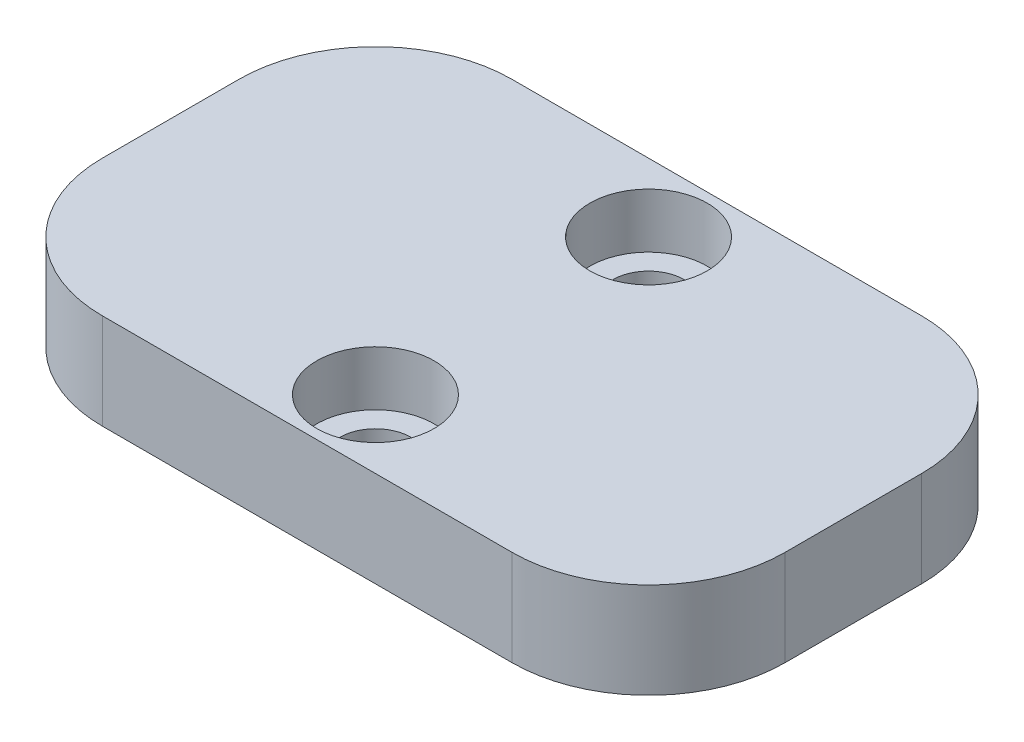
ISO-10303-21;
HEADER;
FILE_DESCRIPTION(('STEP AP214'),'2;1');
FILE_NAME('part.step','',(''),(''),'','','');
FILE_SCHEMA(('AUTOMOTIVE_DESIGN { 1 0 10303 214 1 1 1 1 }'));
ENDSEC;
DATA;
#1=APPLICATION_CONTEXT('core data for automotive mechanical design processes');
#2=APPLICATION_PROTOCOL_DEFINITION('international standard','automotive_design',2000,#1);
#3=PRODUCT_CONTEXT('',#1,'mechanical');
#4=PRODUCT('Part','Part','',(#3));
#5=PRODUCT_RELATED_PRODUCT_CATEGORY('part','',(#4));
#6=PRODUCT_DEFINITION_FORMATION('','',#4);
#7=PRODUCT_DEFINITION_CONTEXT('part definition',#1,'design');
#8=PRODUCT_DEFINITION('design','',#6,#7);
#9=PRODUCT_DEFINITION_SHAPE('','',#8);
#10=(LENGTH_UNIT() NAMED_UNIT(*) SI_UNIT(.MILLI.,.METRE.));
#11=(NAMED_UNIT(*) PLANE_ANGLE_UNIT() SI_UNIT($,.RADIAN.));
#12=(NAMED_UNIT(*) SI_UNIT($,.STERADIAN.) SOLID_ANGLE_UNIT());
#13=UNCERTAINTY_MEASURE_WITH_UNIT(LENGTH_MEASURE(1.E-05),#10,'distance_accuracy_value','');
#14=(GEOMETRIC_REPRESENTATION_CONTEXT(3) GLOBAL_UNCERTAINTY_ASSIGNED_CONTEXT((#13)) GLOBAL_UNIT_ASSIGNED_CONTEXT((#10,
#11,#12)) REPRESENTATION_CONTEXT('',''));
#15=CARTESIAN_POINT('',(0.,0.,0.));
#16=DIRECTION('',(0.,0.,1.));
#17=DIRECTION('',(1.,0.,0.));
#18=AXIS2_PLACEMENT_3D('',#15,#16,#17);
#19=CARTESIAN_POINT('',(25.,7.,-25.));
#20=DIRECTION('',(0.,-1.,0.));
#21=DIRECTION('',(0.,0.,-1.));
#22=AXIS2_PLACEMENT_3D('',#19,#20,#21);
#23=CYLINDRICAL_SURFACE('',#22,2.6);
#24=CARTESIAN_POINT('',(25.,0.,-25.));
#25=DIRECTION('',(0.,1.,0.));
#26=DIRECTION('',(0.,0.,1.));
#27=AXIS2_PLACEMENT_3D('',#24,#25,#26);
#28=CIRCLE('',#27,2.6);
#29=CARTESIAN_POINT('',(25.,0.,-22.4));
#30=VERTEX_POINT('',#29);
#31=EDGE_CURVE('E220',#30,#30,#28,.T.);
#32=ORIENTED_EDGE('',*,*,#31,.F.);
#33=EDGE_LOOP('',(#32));
#34=FACE_BOUND('',#33,.T.);
#35=CARTESIAN_POINT('',(25.,3.,-25.));
#36=DIRECTION('',(0.,1.,0.));
#37=DIRECTION('',(0.,0.,1.));
#38=AXIS2_PLACEMENT_3D('',#35,#36,#37);
#39=CIRCLE('',#38,2.6);
#40=CARTESIAN_POINT('',(25.,3.,-22.4));
#41=VERTEX_POINT('',#40);
#42=EDGE_CURVE('E51',#41,#41,#39,.T.);
#43=ORIENTED_EDGE('',*,*,#42,.T.);
#44=EDGE_LOOP('',(#43));
#45=FACE_BOUND('',#44,.T.);
#46=ADVANCED_FACE('F47',(#34,#45),#23,.F.);
#47=CARTESIAN_POINT('',(25.,7.,-5.));
#48=DIRECTION('',(0.,-1.,0.));
#49=DIRECTION('',(0.,0.,-1.));
#50=AXIS2_PLACEMENT_3D('',#47,#48,#49);
#51=CYLINDRICAL_SURFACE('',#50,2.6);
#52=CARTESIAN_POINT('',(25.,0.,-5.));
#53=DIRECTION('',(0.,1.,0.));
#54=DIRECTION('',(0.,0.,1.));
#55=AXIS2_PLACEMENT_3D('',#52,#53,#54);
#56=CIRCLE('',#55,2.6);
#57=CARTESIAN_POINT('',(25.,0.,-2.4));
#58=VERTEX_POINT('',#57);
#59=EDGE_CURVE('E199',#58,#58,#56,.T.);
#60=ORIENTED_EDGE('',*,*,#59,.F.);
#61=EDGE_LOOP('',(#60));
#62=FACE_BOUND('',#61,.T.);
#63=CARTESIAN_POINT('',(25.,3.,-5.));
#64=DIRECTION('',(0.,1.,0.));
#65=DIRECTION('',(0.,0.,1.));
#66=AXIS2_PLACEMENT_3D('',#63,#64,#65);
#67=CIRCLE('',#66,2.6);
#68=CARTESIAN_POINT('',(25.,3.,-2.4));
#69=VERTEX_POINT('',#68);
#70=EDGE_CURVE('E190',#69,#69,#67,.T.);
#71=ORIENTED_EDGE('',*,*,#70,.T.);
#72=EDGE_LOOP('',(#71));
#73=FACE_BOUND('',#72,.T.);
#74=ADVANCED_FACE('F256',(#62,#73),#51,.F.);
#75=CARTESIAN_POINT('',(0.,7.,0.));
#76=DIRECTION('',(0.,-1.,0.));
#77=DIRECTION('',(0.,0.,-1.));
#78=AXIS2_PLACEMENT_3D('',#75,#76,#77);
#79=PLANE('',#78);
#80=CARTESIAN_POINT('',(25.,7.,-25.));
#81=DIRECTION('',(0.,1.,0.));
#82=DIRECTION('',(0.,0.,1.));
#83=AXIS2_PLACEMENT_3D('',#80,#81,#82);
#84=CIRCLE('',#83,4.3);
#85=CARTESIAN_POINT('',(25.,7.,-20.7));
#86=VERTEX_POINT('',#85);
#87=EDGE_CURVE('E201',#86,#86,#84,.T.);
#88=ORIENTED_EDGE('',*,*,#87,.F.);
#89=EDGE_LOOP('',(#88));
#90=FACE_BOUND('',#89,.T.);
#91=CARTESIAN_POINT('',(25.,7.,-5.));
#92=DIRECTION('',(0.,1.,0.));
#93=DIRECTION('',(0.,0.,1.));
#94=AXIS2_PLACEMENT_3D('',#91,#92,#93);
#95=CIRCLE('',#94,4.3);
#96=CARTESIAN_POINT('',(25.,7.,-0.7));
#97=VERTEX_POINT('',#96);
#98=EDGE_CURVE('E207',#97,#97,#95,.T.);
#99=ORIENTED_EDGE('',*,*,#98,.F.);
#100=EDGE_LOOP('',(#99));
#101=FACE_BOUND('',#100,.T.);
#102=DIRECTION('',(0.,0.,-1.));
#103=VECTOR('',#102,1.);
#104=CARTESIAN_POINT('',(50.,7.,0.));
#105=LINE('',#104,#103);
#106=CARTESIAN_POINT('',(50.,7.,-10.));
#107=VERTEX_POINT('',#106);
#108=CARTESIAN_POINT('',(50.,7.,-20.));
#109=VERTEX_POINT('',#108);
#110=EDGE_CURVE('E227',#107,#109,#105,.T.);
#111=ORIENTED_EDGE('',*,*,#110,.T.);
#112=CARTESIAN_POINT('',(40.,7.,-20.));
#113=DIRECTION('',(0.,-1.,0.));
#114=DIRECTION('',(0.,0.,-1.));
#115=AXIS2_PLACEMENT_3D('',#112,#113,#114);
#116=CIRCLE('',#115,10.);
#117=CARTESIAN_POINT('',(40.,7.,-30.));
#118=VERTEX_POINT('',#117);
#119=EDGE_CURVE('E179',#109,#118,#116,.F.);
#120=ORIENTED_EDGE('',*,*,#119,.T.);
#121=DIRECTION('',(-1.,0.,0.));
#122=VECTOR('',#121,1.);
#123=CARTESIAN_POINT('',(0.,7.,-30.));
#124=LINE('',#123,#122);
#125=CARTESIAN_POINT('',(10.,7.,-30.));
#126=VERTEX_POINT('',#125);
#127=EDGE_CURVE('E137',#118,#126,#124,.T.);
#128=ORIENTED_EDGE('',*,*,#127,.T.);
#129=CARTESIAN_POINT('',(10.,7.,-20.));
#130=DIRECTION('',(0.,-1.,0.));
#131=DIRECTION('',(0.,0.,-1.));
#132=AXIS2_PLACEMENT_3D('',#129,#130,#131);
#133=CIRCLE('',#132,10.);
#134=CARTESIAN_POINT('',(0.,7.,-20.));
#135=VERTEX_POINT('',#134);
#136=EDGE_CURVE('E176',#126,#135,#133,.F.);
#137=ORIENTED_EDGE('',*,*,#136,.T.);
#138=DIRECTION('',(0.,0.,1.));
#139=VECTOR('',#138,1.);
#140=CARTESIAN_POINT('',(0.,7.,0.));
#141=LINE('',#140,#139);
#142=CARTESIAN_POINT('',(0.,7.,-10.));
#143=VERTEX_POINT('',#142);
#144=EDGE_CURVE('E146',#135,#143,#141,.T.);
#145=ORIENTED_EDGE('',*,*,#144,.T.);
#146=CARTESIAN_POINT('',(10.,7.,-10.));
#147=DIRECTION('',(0.,-1.,0.));
#148=DIRECTION('',(0.,0.,-1.));
#149=AXIS2_PLACEMENT_3D('',#146,#147,#148);
#150=CIRCLE('',#149,10.);
#151=CARTESIAN_POINT('',(10.,7.,0.));
#152=VERTEX_POINT('',#151);
#153=EDGE_CURVE('E71',#143,#152,#150,.F.);
#154=ORIENTED_EDGE('',*,*,#153,.T.);
#155=DIRECTION('',(1.,0.,0.));
#156=VECTOR('',#155,1.);
#157=CARTESIAN_POINT('',(0.,7.,0.));
#158=LINE('',#157,#156);
#159=CARTESIAN_POINT('',(40.,7.,0.));
#160=VERTEX_POINT('',#159);
#161=EDGE_CURVE('E151',#152,#160,#158,.T.);
#162=ORIENTED_EDGE('',*,*,#161,.T.);
#163=CARTESIAN_POINT('',(40.,7.,-10.));
#164=DIRECTION('',(0.,-1.,0.));
#165=DIRECTION('',(0.,0.,-1.));
#166=AXIS2_PLACEMENT_3D('',#163,#164,#165);
#167=CIRCLE('',#166,10.);
#168=EDGE_CURVE('E171',#160,#107,#167,.F.);
#169=ORIENTED_EDGE('',*,*,#168,.T.);
#170=EDGE_LOOP('',(#111,#120,#128,#137,#145,#154,#162,#169));
#171=FACE_BOUND('',#170,.T.);
#172=ADVANCED_FACE('F243',(#90,#101,#171),#79,.F.);
#173=CARTESIAN_POINT('',(0.,0.,0.));
#174=DIRECTION('',(0.,-1.,0.));
#175=DIRECTION('',(0.,0.,-1.));
#176=AXIS2_PLACEMENT_3D('',#173,#174,#175);
#177=PLANE('',#176);
#178=ORIENTED_EDGE('',*,*,#31,.T.);
#179=EDGE_LOOP('',(#178));
#180=FACE_BOUND('',#179,.T.);
#181=DIRECTION('',(-1.,0.,0.));
#182=VECTOR('',#181,1.);
#183=CARTESIAN_POINT('',(0.,0.,-30.));
#184=LINE('',#183,#182);
#185=CARTESIAN_POINT('',(40.,0.,-30.));
#186=VERTEX_POINT('',#185);
#187=CARTESIAN_POINT('',(10.,0.,-30.));
#188=VERTEX_POINT('',#187);
#189=EDGE_CURVE('E134',#186,#188,#184,.T.);
#190=ORIENTED_EDGE('',*,*,#189,.F.);
#191=CARTESIAN_POINT('',(40.,0.,-20.));
#192=DIRECTION('',(0.,-1.,0.));
#193=DIRECTION('',(0.,0.,-1.));
#194=AXIS2_PLACEMENT_3D('',#191,#192,#193);
#195=CIRCLE('',#194,10.);
#196=CARTESIAN_POINT('',(50.,0.,-20.));
#197=VERTEX_POINT('',#196);
#198=EDGE_CURVE('E116',#186,#197,#195,.T.);
#199=ORIENTED_EDGE('',*,*,#198,.T.);
#200=DIRECTION('',(0.,0.,-1.));
#201=VECTOR('',#200,1.);
#202=CARTESIAN_POINT('',(50.,0.,0.));
#203=LINE('',#202,#201);
#204=CARTESIAN_POINT('',(50.,0.,-10.));
#205=VERTEX_POINT('',#204);
#206=EDGE_CURVE('E147',#205,#197,#203,.T.);
#207=ORIENTED_EDGE('',*,*,#206,.F.);
#208=CARTESIAN_POINT('',(40.,0.,-10.));
#209=DIRECTION('',(0.,-1.,0.));
#210=DIRECTION('',(0.,0.,-1.));
#211=AXIS2_PLACEMENT_3D('',#208,#209,#210);
#212=CIRCLE('',#211,10.);
#213=CARTESIAN_POINT('',(40.,0.,0.));
#214=VERTEX_POINT('',#213);
#215=EDGE_CURVE('E139',#205,#214,#212,.T.);
#216=ORIENTED_EDGE('',*,*,#215,.T.);
#217=DIRECTION('',(1.,0.,0.));
#218=VECTOR('',#217,1.);
#219=CARTESIAN_POINT('',(0.,0.,0.));
#220=LINE('',#219,#218);
#221=CARTESIAN_POINT('',(10.,0.,0.));
#222=VERTEX_POINT('',#221);
#223=EDGE_CURVE('E153',#222,#214,#220,.T.);
#224=ORIENTED_EDGE('',*,*,#223,.F.);
#225=CARTESIAN_POINT('',(10.,0.,-10.));
#226=DIRECTION('',(0.,-1.,0.));
#227=DIRECTION('',(0.,0.,-1.));
#228=AXIS2_PLACEMENT_3D('',#225,#226,#227);
#229=CIRCLE('',#228,10.);
#230=CARTESIAN_POINT('',(0.,0.,-10.));
#231=VERTEX_POINT('',#230);
#232=EDGE_CURVE('E161',#222,#231,#229,.T.);
#233=ORIENTED_EDGE('',*,*,#232,.T.);
#234=DIRECTION('',(0.,0.,1.));
#235=VECTOR('',#234,1.);
#236=CARTESIAN_POINT('',(0.,0.,0.));
#237=LINE('',#236,#235);
#238=CARTESIAN_POINT('',(0.,0.,-20.));
#239=VERTEX_POINT('',#238);
#240=EDGE_CURVE('E223',#239,#231,#237,.T.);
#241=ORIENTED_EDGE('',*,*,#240,.F.);
#242=CARTESIAN_POINT('',(10.,0.,-20.));
#243=DIRECTION('',(0.,-1.,0.));
#244=DIRECTION('',(0.,0.,-1.));
#245=AXIS2_PLACEMENT_3D('',#242,#243,#244);
#246=CIRCLE('',#245,10.);
#247=EDGE_CURVE('E128',#239,#188,#246,.T.);
#248=ORIENTED_EDGE('',*,*,#247,.T.);
#249=EDGE_LOOP('',(#190,#199,#207,#216,#224,#233,#241,#248));
#250=FACE_BOUND('',#249,.T.);
#251=ORIENTED_EDGE('',*,*,#59,.T.);
#252=EDGE_LOOP('',(#251));
#253=FACE_BOUND('',#252,.T.);
#254=ADVANCED_FACE('F142',(#180,#250,#253),#177,.T.);
#255=CARTESIAN_POINT('',(0.,7.,0.));
#256=DIRECTION('',(1.,0.,0.));
#257=DIRECTION('',(0.,0.,-1.));
#258=AXIS2_PLACEMENT_3D('',#255,#256,#257);
#259=PLANE('',#258);
#260=ORIENTED_EDGE('',*,*,#144,.F.);
#261=DIRECTION('',(0.,-1.,0.));
#262=VECTOR('',#261,1.);
#263=CARTESIAN_POINT('',(0.,7.,-20.));
#264=LINE('',#263,#262);
#265=EDGE_CURVE('E185',#135,#239,#264,.T.);
#266=ORIENTED_EDGE('',*,*,#265,.T.);
#267=ORIENTED_EDGE('',*,*,#240,.T.);
#268=DIRECTION('',(0.,-1.,0.));
#269=VECTOR('',#268,1.);
#270=CARTESIAN_POINT('',(0.,7.,-10.));
#271=LINE('',#270,#269);
#272=EDGE_CURVE('E182',#231,#143,#271,.F.);
#273=ORIENTED_EDGE('',*,*,#272,.T.);
#274=EDGE_LOOP('',(#260,#266,#267,#273));
#275=FACE_BOUND('',#274,.T.);
#276=ADVANCED_FACE('F253',(#275),#259,.F.);
#277=CARTESIAN_POINT('',(0.,7.,0.));
#278=DIRECTION('',(0.,0.,-1.));
#279=DIRECTION('',(-1.,0.,0.));
#280=AXIS2_PLACEMENT_3D('',#277,#278,#279);
#281=PLANE('',#280);
#282=ORIENTED_EDGE('',*,*,#161,.F.);
#283=DIRECTION('',(0.,-1.,0.));
#284=VECTOR('',#283,1.);
#285=CARTESIAN_POINT('',(10.,7.,0.));
#286=LINE('',#285,#284);
#287=EDGE_CURVE('E11',#152,#222,#286,.T.);
#288=ORIENTED_EDGE('',*,*,#287,.T.);
#289=ORIENTED_EDGE('',*,*,#223,.T.);
#290=DIRECTION('',(0.,-1.,0.));
#291=VECTOR('',#290,1.);
#292=CARTESIAN_POINT('',(40.,7.,0.));
#293=LINE('',#292,#291);
#294=EDGE_CURVE('E57',#214,#160,#293,.F.);
#295=ORIENTED_EDGE('',*,*,#294,.T.);
#296=EDGE_LOOP('',(#282,#288,#289,#295));
#297=FACE_BOUND('',#296,.T.);
#298=ADVANCED_FACE('F237',(#297),#281,.F.);
#299=CARTESIAN_POINT('',(50.,7.,0.));
#300=DIRECTION('',(-1.,0.,0.));
#301=DIRECTION('',(0.,0.,1.));
#302=AXIS2_PLACEMENT_3D('',#299,#300,#301);
#303=PLANE('',#302);
#304=ORIENTED_EDGE('',*,*,#206,.T.);
#305=DIRECTION('',(0.,-1.,0.));
#306=VECTOR('',#305,1.);
#307=CARTESIAN_POINT('',(50.,7.,-20.));
#308=LINE('',#307,#306);
#309=EDGE_CURVE('E121',#197,#109,#308,.F.);
#310=ORIENTED_EDGE('',*,*,#309,.T.);
#311=ORIENTED_EDGE('',*,*,#110,.F.);
#312=DIRECTION('',(0.,-1.,0.));
#313=VECTOR('',#312,1.);
#314=CARTESIAN_POINT('',(50.,7.,-10.));
#315=LINE('',#314,#313);
#316=EDGE_CURVE('E127',#107,#205,#315,.T.);
#317=ORIENTED_EDGE('',*,*,#316,.T.);
#318=EDGE_LOOP('',(#304,#310,#311,#317));
#319=FACE_BOUND('',#318,.T.);
#320=ADVANCED_FACE('F245',(#319),#303,.F.);
#321=CARTESIAN_POINT('',(0.,7.,-30.));
#322=DIRECTION('',(0.,0.,1.));
#323=DIRECTION('',(1.,0.,0.));
#324=AXIS2_PLACEMENT_3D('',#321,#322,#323);
#325=PLANE('',#324);
#326=ORIENTED_EDGE('',*,*,#127,.F.);
#327=DIRECTION('',(0.,-1.,0.));
#328=VECTOR('',#327,1.);
#329=CARTESIAN_POINT('',(40.,7.,-30.));
#330=LINE('',#329,#328);
#331=EDGE_CURVE('E120',#118,#186,#330,.T.);
#332=ORIENTED_EDGE('',*,*,#331,.T.);
#333=ORIENTED_EDGE('',*,*,#189,.T.);
#334=DIRECTION('',(0.,-1.,0.));
#335=VECTOR('',#334,1.);
#336=CARTESIAN_POINT('',(10.,7.,-30.));
#337=LINE('',#336,#335);
#338=EDGE_CURVE('E140',#188,#126,#337,.F.);
#339=ORIENTED_EDGE('',*,*,#338,.T.);
#340=EDGE_LOOP('',(#326,#332,#333,#339));
#341=FACE_BOUND('',#340,.T.);
#342=ADVANCED_FACE('F133',(#341),#325,.F.);
#343=CARTESIAN_POINT('',(40.,7.,-20.));
#344=DIRECTION('',(0.,-1.,0.));
#345=DIRECTION('',(0.,0.,-1.));
#346=AXIS2_PLACEMENT_3D('',#343,#344,#345);
#347=CYLINDRICAL_SURFACE('',#346,10.);
#348=ORIENTED_EDGE('',*,*,#119,.F.);
#349=ORIENTED_EDGE('',*,*,#309,.F.);
#350=ORIENTED_EDGE('',*,*,#198,.F.);
#351=ORIENTED_EDGE('',*,*,#331,.F.);
#352=EDGE_LOOP('',(#348,#349,#350,#351));
#353=FACE_BOUND('',#352,.T.);
#354=ADVANCED_FACE('F119',(#353),#347,.T.);
#355=CARTESIAN_POINT('',(10.,7.,-20.));
#356=DIRECTION('',(0.,-1.,0.));
#357=DIRECTION('',(0.,0.,-1.));
#358=AXIS2_PLACEMENT_3D('',#355,#356,#357);
#359=CYLINDRICAL_SURFACE('',#358,10.);
#360=ORIENTED_EDGE('',*,*,#136,.F.);
#361=ORIENTED_EDGE('',*,*,#338,.F.);
#362=ORIENTED_EDGE('',*,*,#247,.F.);
#363=ORIENTED_EDGE('',*,*,#265,.F.);
#364=EDGE_LOOP('',(#360,#361,#362,#363));
#365=FACE_BOUND('',#364,.T.);
#366=ADVANCED_FACE('F285',(#365),#359,.T.);
#367=CARTESIAN_POINT('',(10.,7.,-10.));
#368=DIRECTION('',(0.,-1.,0.));
#369=DIRECTION('',(0.,0.,-1.));
#370=AXIS2_PLACEMENT_3D('',#367,#368,#369);
#371=CYLINDRICAL_SURFACE('',#370,10.);
#372=ORIENTED_EDGE('',*,*,#153,.F.);
#373=ORIENTED_EDGE('',*,*,#272,.F.);
#374=ORIENTED_EDGE('',*,*,#232,.F.);
#375=ORIENTED_EDGE('',*,*,#287,.F.);
#376=EDGE_LOOP('',(#372,#373,#374,#375));
#377=FACE_BOUND('',#376,.T.);
#378=ADVANCED_FACE('F287',(#377),#371,.T.);
#379=CARTESIAN_POINT('',(40.,7.,-10.));
#380=DIRECTION('',(0.,-1.,0.));
#381=DIRECTION('',(0.,0.,-1.));
#382=AXIS2_PLACEMENT_3D('',#379,#380,#381);
#383=CYLINDRICAL_SURFACE('',#382,10.);
#384=ORIENTED_EDGE('',*,*,#168,.F.);
#385=ORIENTED_EDGE('',*,*,#294,.F.);
#386=ORIENTED_EDGE('',*,*,#215,.F.);
#387=ORIENTED_EDGE('',*,*,#316,.F.);
#388=EDGE_LOOP('',(#384,#385,#386,#387));
#389=FACE_BOUND('',#388,.T.);
#390=ADVANCED_FACE('F49',(#389),#383,.T.);
#391=CARTESIAN_POINT('',(25.,3.,-5.));
#392=DIRECTION('',(0.,1.,0.));
#393=DIRECTION('',(0.,0.,1.));
#394=AXIS2_PLACEMENT_3D('',#391,#392,#393);
#395=CYLINDRICAL_SURFACE('',#394,4.3);
#396=CARTESIAN_POINT('',(25.,3.,-5.));
#397=DIRECTION('',(0.,1.,0.));
#398=DIRECTION('',(0.,0.,1.));
#399=AXIS2_PLACEMENT_3D('',#396,#397,#398);
#400=CIRCLE('',#399,4.3);
#401=CARTESIAN_POINT('',(25.,3.,-0.7));
#402=VERTEX_POINT('',#401);
#403=EDGE_CURVE('E213',#402,#402,#400,.T.);
#404=ORIENTED_EDGE('',*,*,#403,.F.);
#405=EDGE_LOOP('',(#404));
#406=FACE_BOUND('',#405,.T.);
#407=ORIENTED_EDGE('',*,*,#98,.T.);
#408=EDGE_LOOP('',(#407));
#409=FACE_BOUND('',#408,.T.);
#410=ADVANCED_FACE('F293',(#406,#409),#395,.F.);
#411=CARTESIAN_POINT('',(25.,3.,-5.));
#412=DIRECTION('',(0.,1.,0.));
#413=DIRECTION('',(0.,0.,1.));
#414=AXIS2_PLACEMENT_3D('',#411,#412,#413);
#415=PLANE('',#414);
#416=ORIENTED_EDGE('',*,*,#70,.F.);
#417=EDGE_LOOP('',(#416));
#418=FACE_BOUND('',#417,.T.);
#419=ORIENTED_EDGE('',*,*,#403,.T.);
#420=EDGE_LOOP('',(#419));
#421=FACE_BOUND('',#420,.T.);
#422=ADVANCED_FACE('F300',(#418,#421),#415,.T.);
#423=CARTESIAN_POINT('',(25.,3.,-25.));
#424=DIRECTION('',(0.,1.,0.));
#425=DIRECTION('',(0.,0.,1.));
#426=AXIS2_PLACEMENT_3D('',#423,#424,#425);
#427=CYLINDRICAL_SURFACE('',#426,4.3);
#428=CARTESIAN_POINT('',(25.,3.,-25.));
#429=DIRECTION('',(0.,1.,0.));
#430=DIRECTION('',(0.,0.,1.));
#431=AXIS2_PLACEMENT_3D('',#428,#429,#430);
#432=CIRCLE('',#431,4.3);
#433=CARTESIAN_POINT('',(25.,3.,-20.7));
#434=VERTEX_POINT('',#433);
#435=EDGE_CURVE('E193',#434,#434,#432,.T.);
#436=ORIENTED_EDGE('',*,*,#435,.F.);
#437=EDGE_LOOP('',(#436));
#438=FACE_BOUND('',#437,.T.);
#439=ORIENTED_EDGE('',*,*,#87,.T.);
#440=EDGE_LOOP('',(#439));
#441=FACE_BOUND('',#440,.T.);
#442=ADVANCED_FACE('F306',(#438,#441),#427,.F.);
#443=CARTESIAN_POINT('',(25.,3.,-25.));
#444=DIRECTION('',(0.,1.,0.));
#445=DIRECTION('',(0.,0.,1.));
#446=AXIS2_PLACEMENT_3D('',#443,#444,#445);
#447=PLANE('',#446);
#448=ORIENTED_EDGE('',*,*,#42,.F.);
#449=EDGE_LOOP('',(#448));
#450=FACE_BOUND('',#449,.T.);
#451=ORIENTED_EDGE('',*,*,#435,.T.);
#452=EDGE_LOOP('',(#451));
#453=FACE_BOUND('',#452,.T.);
#454=ADVANCED_FACE('F313',(#450,#453),#447,.T.);
#455=CLOSED_SHELL('',(#46,#74,#172,#254,#276,#298,#320,#342,#354,#366,#378,#390,#410,#422,#442,#454));
#456=MANIFOLD_SOLID_BREP('B2',#455);
#457=ADVANCED_BREP_SHAPE_REPRESENTATION('',(#18,#456),#14);
#458=SHAPE_DEFINITION_REPRESENTATION(#9,#457);
ENDSEC;
END-ISO-10303-21;
